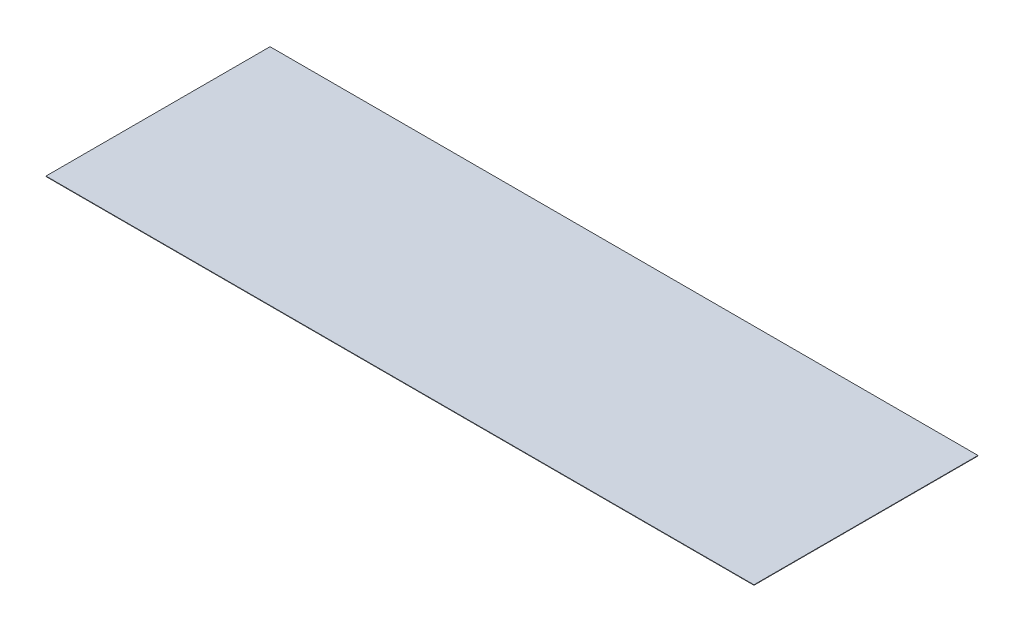
ISO-10303-21;
HEADER;
FILE_DESCRIPTION(('STEP AP214'),'2;1');
FILE_NAME('part.step','',(''),(''),'','','');
FILE_SCHEMA(('AUTOMOTIVE_DESIGN { 1 0 10303 214 1 1 1 1 }'));
ENDSEC;
DATA;
#1=APPLICATION_CONTEXT('core data for automotive mechanical design processes');
#2=APPLICATION_PROTOCOL_DEFINITION('international standard','automotive_design',2000,#1);
#3=PRODUCT_CONTEXT('',#1,'mechanical');
#4=PRODUCT('Part','Part','',(#3));
#5=PRODUCT_RELATED_PRODUCT_CATEGORY('part','',(#4));
#6=PRODUCT_DEFINITION_FORMATION('','',#4);
#7=PRODUCT_DEFINITION_CONTEXT('part definition',#1,'design');
#8=PRODUCT_DEFINITION('design','',#6,#7);
#9=PRODUCT_DEFINITION_SHAPE('','',#8);
#10=(LENGTH_UNIT() NAMED_UNIT(*) SI_UNIT(.MILLI.,.METRE.));
#11=(NAMED_UNIT(*) PLANE_ANGLE_UNIT() SI_UNIT($,.RADIAN.));
#12=(NAMED_UNIT(*) SI_UNIT($,.STERADIAN.) SOLID_ANGLE_UNIT());
#13=UNCERTAINTY_MEASURE_WITH_UNIT(LENGTH_MEASURE(1.E-05),#10,'distance_accuracy_value','');
#14=(GEOMETRIC_REPRESENTATION_CONTEXT(3) GLOBAL_UNCERTAINTY_ASSIGNED_CONTEXT((#13)) GLOBAL_UNIT_ASSIGNED_CONTEXT((#10,
#11,#12)) REPRESENTATION_CONTEXT('',''));
#15=CARTESIAN_POINT('',(0.,0.,0.));
#16=DIRECTION('',(0.,0.,1.));
#17=DIRECTION('',(1.,0.,0.));
#18=AXIS2_PLACEMENT_3D('',#15,#16,#17);
#19=CARTESIAN_POINT('',(-3950.,5.,1250.));
#20=DIRECTION('',(1.,0.,0.));
#21=DIRECTION('',(0.,0.,-1.));
#22=AXIS2_PLACEMENT_3D('',#19,#20,#21);
#23=PLANE('',#22);
#24=DIRECTION('',(0.,0.,1.));
#25=VECTOR('',#24,1.);
#26=CARTESIAN_POINT('',(-3950.,0.,1250.));
#27=LINE('',#26,#25);
#28=CARTESIAN_POINT('',(-3950.,0.,-1250.));
#29=VERTEX_POINT('',#28);
#30=CARTESIAN_POINT('',(-3950.,0.,1250.));
#31=VERTEX_POINT('',#30);
#32=EDGE_CURVE('E96',#29,#31,#27,.T.);
#33=ORIENTED_EDGE('',*,*,#32,.T.);
#34=DIRECTION('',(0.,-1.,0.));
#35=VECTOR('',#34,1.);
#36=CARTESIAN_POINT('',(-3950.,5.,1250.));
#37=LINE('',#36,#35);
#38=CARTESIAN_POINT('',(-3950.,5.,1250.));
#39=VERTEX_POINT('',#38);
#40=EDGE_CURVE('E11',#39,#31,#37,.T.);
#41=ORIENTED_EDGE('',*,*,#40,.F.);
#42=DIRECTION('',(0.,0.,1.));
#43=VECTOR('',#42,1.);
#44=CARTESIAN_POINT('',(-3950.,5.,1250.));
#45=LINE('',#44,#43);
#46=CARTESIAN_POINT('',(-3950.,5.,-1250.));
#47=VERTEX_POINT('',#46);
#48=EDGE_CURVE('E84',#47,#39,#45,.T.);
#49=ORIENTED_EDGE('',*,*,#48,.F.);
#50=DIRECTION('',(0.,-1.,0.));
#51=VECTOR('',#50,1.);
#52=CARTESIAN_POINT('',(-3950.,5.,-1250.));
#53=LINE('',#52,#51);
#54=EDGE_CURVE('E92',#47,#29,#53,.T.);
#55=ORIENTED_EDGE('',*,*,#54,.T.);
#56=EDGE_LOOP('',(#33,#41,#49,#55));
#57=FACE_BOUND('',#56,.T.);
#58=ADVANCED_FACE('F33',(#57),#23,.F.);
#59=CARTESIAN_POINT('',(3950.,5.,1250.));
#60=DIRECTION('',(0.,0.,-1.));
#61=DIRECTION('',(-1.,0.,0.));
#62=AXIS2_PLACEMENT_3D('',#59,#60,#61);
#63=PLANE('',#62);
#64=DIRECTION('',(1.,0.,0.));
#65=VECTOR('',#64,1.);
#66=CARTESIAN_POINT('',(3950.,0.,1250.));
#67=LINE('',#66,#65);
#68=CARTESIAN_POINT('',(3950.,0.,1250.));
#69=VERTEX_POINT('',#68);
#70=EDGE_CURVE('E88',#31,#69,#67,.T.);
#71=ORIENTED_EDGE('',*,*,#70,.T.);
#72=DIRECTION('',(0.,-1.,0.));
#73=VECTOR('',#72,1.);
#74=CARTESIAN_POINT('',(3950.,5.,1250.));
#75=LINE('',#74,#73);
#76=CARTESIAN_POINT('',(3950.,5.,1250.));
#77=VERTEX_POINT('',#76);
#78=EDGE_CURVE('E41',#77,#69,#75,.T.);
#79=ORIENTED_EDGE('',*,*,#78,.F.);
#80=DIRECTION('',(1.,0.,0.));
#81=VECTOR('',#80,1.);
#82=CARTESIAN_POINT('',(3950.,5.,1250.));
#83=LINE('',#82,#81);
#84=EDGE_CURVE('E79',#39,#77,#83,.T.);
#85=ORIENTED_EDGE('',*,*,#84,.F.);
#86=ORIENTED_EDGE('',*,*,#40,.T.);
#87=EDGE_LOOP('',(#71,#79,#85,#86));
#88=FACE_BOUND('',#87,.T.);
#89=ADVANCED_FACE('F87',(#88),#63,.F.);
#90=CARTESIAN_POINT('',(3950.,5.,1250.));
#91=DIRECTION('',(-1.,0.,0.));
#92=DIRECTION('',(0.,0.,1.));
#93=AXIS2_PLACEMENT_3D('',#90,#91,#92);
#94=PLANE('',#93);
#95=DIRECTION('',(0.,0.,-1.));
#96=VECTOR('',#95,1.);
#97=CARTESIAN_POINT('',(3950.,0.,1250.));
#98=LINE('',#97,#96);
#99=CARTESIAN_POINT('',(3950.,0.,-1250.));
#100=VERTEX_POINT('',#99);
#101=EDGE_CURVE('E66',#69,#100,#98,.T.);
#102=ORIENTED_EDGE('',*,*,#101,.T.);
#103=DIRECTION('',(0.,-1.,0.));
#104=VECTOR('',#103,1.);
#105=CARTESIAN_POINT('',(3950.,5.,-1250.));
#106=LINE('',#105,#104);
#107=CARTESIAN_POINT('',(3950.,5.,-1250.));
#108=VERTEX_POINT('',#107);
#109=EDGE_CURVE('E89',#108,#100,#106,.T.);
#110=ORIENTED_EDGE('',*,*,#109,.F.);
#111=DIRECTION('',(0.,0.,-1.));
#112=VECTOR('',#111,1.);
#113=CARTESIAN_POINT('',(3950.,5.,1250.));
#114=LINE('',#113,#112);
#115=EDGE_CURVE('E82',#77,#108,#114,.T.);
#116=ORIENTED_EDGE('',*,*,#115,.F.);
#117=ORIENTED_EDGE('',*,*,#78,.T.);
#118=EDGE_LOOP('',(#102,#110,#116,#117));
#119=FACE_BOUND('',#118,.T.);
#120=ADVANCED_FACE('F90',(#119),#94,.F.);
#121=CARTESIAN_POINT('',(3950.,5.,-1250.));
#122=DIRECTION('',(0.,0.,1.));
#123=DIRECTION('',(1.,0.,0.));
#124=AXIS2_PLACEMENT_3D('',#121,#122,#123);
#125=PLANE('',#124);
#126=DIRECTION('',(-1.,0.,0.));
#127=VECTOR('',#126,1.);
#128=CARTESIAN_POINT('',(3950.,0.,-1250.));
#129=LINE('',#128,#127);
#130=EDGE_CURVE('E72',#100,#29,#129,.T.);
#131=ORIENTED_EDGE('',*,*,#130,.T.);
#132=ORIENTED_EDGE('',*,*,#54,.F.);
#133=DIRECTION('',(-1.,0.,0.));
#134=VECTOR('',#133,1.);
#135=CARTESIAN_POINT('',(3950.,5.,-1250.));
#136=LINE('',#135,#134);
#137=EDGE_CURVE('E49',#108,#47,#136,.T.);
#138=ORIENTED_EDGE('',*,*,#137,.F.);
#139=ORIENTED_EDGE('',*,*,#109,.T.);
#140=EDGE_LOOP('',(#131,#132,#138,#139));
#141=FACE_BOUND('',#140,.T.);
#142=ADVANCED_FACE('F103',(#141),#125,.F.);
#143=CARTESIAN_POINT('',(0.,5.,0.));
#144=DIRECTION('',(0.,1.,0.));
#145=DIRECTION('',(0.,0.,1.));
#146=AXIS2_PLACEMENT_3D('',#143,#144,#145);
#147=PLANE('',#146);
#148=ORIENTED_EDGE('',*,*,#48,.T.);
#149=ORIENTED_EDGE('',*,*,#84,.T.);
#150=ORIENTED_EDGE('',*,*,#115,.T.);
#151=ORIENTED_EDGE('',*,*,#137,.T.);
#152=EDGE_LOOP('',(#148,#149,#150,#151));
#153=FACE_BOUND('',#152,.T.);
#154=ADVANCED_FACE('F80',(#153),#147,.T.);
#155=CARTESIAN_POINT('',(0.,0.,0.));
#156=DIRECTION('',(0.,1.,0.));
#157=DIRECTION('',(0.,0.,1.));
#158=AXIS2_PLACEMENT_3D('',#155,#156,#157);
#159=PLANE('',#158);
#160=ORIENTED_EDGE('',*,*,#32,.F.);
#161=ORIENTED_EDGE('',*,*,#130,.F.);
#162=ORIENTED_EDGE('',*,*,#101,.F.);
#163=ORIENTED_EDGE('',*,*,#70,.F.);
#164=EDGE_LOOP('',(#160,#161,#162,#163));
#165=FACE_BOUND('',#164,.T.);
#166=ADVANCED_FACE('F106',(#165),#159,.F.);
#167=CLOSED_SHELL('',(#58,#89,#120,#142,#154,#166));
#168=MANIFOLD_SOLID_BREP('B2',#167);
#169=ADVANCED_BREP_SHAPE_REPRESENTATION('',(#18,#168),#14);
#170=SHAPE_DEFINITION_REPRESENTATION(#9,#169);
ENDSEC;
END-ISO-10303-21;
